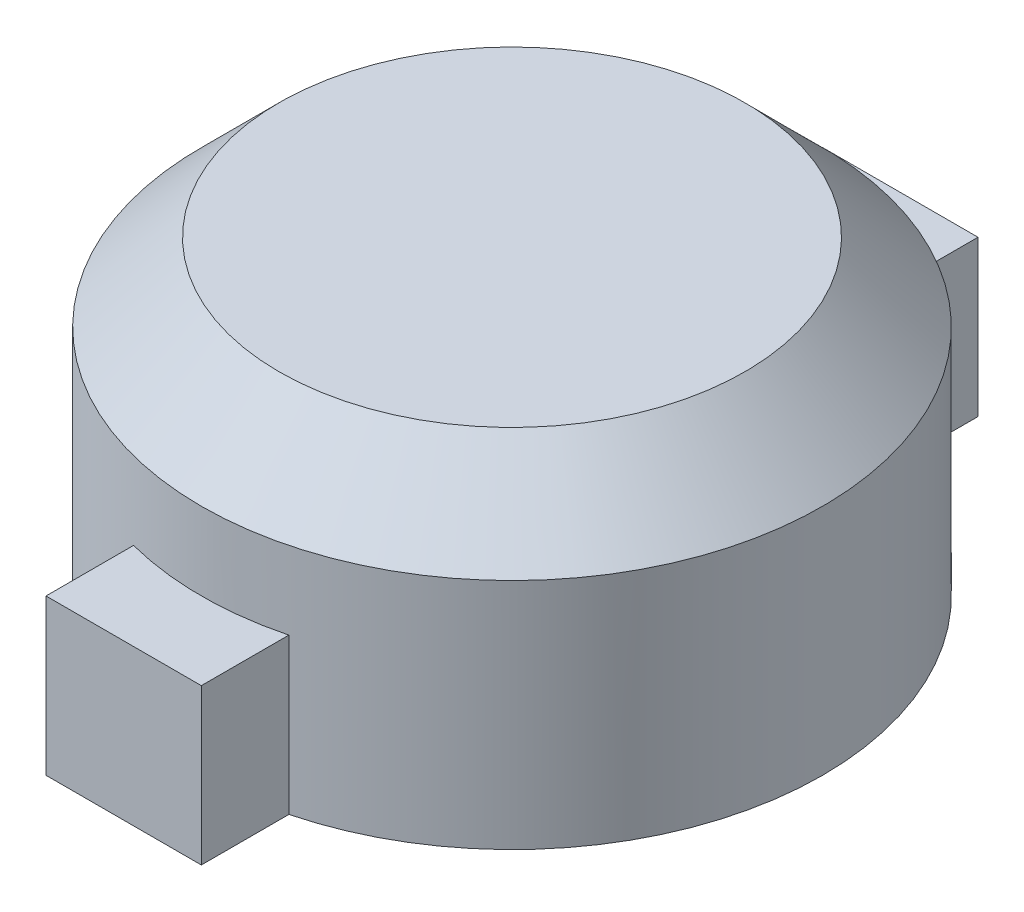
ISO-10303-21;
HEADER;
FILE_DESCRIPTION(('STEP AP214'),'2;1');
FILE_NAME('part.step','',(''),(''),'','','');
FILE_SCHEMA(('AUTOMOTIVE_DESIGN { 1 0 10303 214 1 1 1 1 }'));
ENDSEC;
DATA;
#1=APPLICATION_CONTEXT('core data for automotive mechanical design processes');
#2=APPLICATION_PROTOCOL_DEFINITION('international standard','automotive_design',2000,#1);
#3=PRODUCT_CONTEXT('',#1,'mechanical');
#4=PRODUCT('Part','Part','',(#3));
#5=PRODUCT_RELATED_PRODUCT_CATEGORY('part','',(#4));
#6=PRODUCT_DEFINITION_FORMATION('','',#4);
#7=PRODUCT_DEFINITION_CONTEXT('part definition',#1,'design');
#8=PRODUCT_DEFINITION('design','',#6,#7);
#9=PRODUCT_DEFINITION_SHAPE('','',#8);
#10=(LENGTH_UNIT() NAMED_UNIT(*) SI_UNIT(.MILLI.,.METRE.));
#11=(NAMED_UNIT(*) PLANE_ANGLE_UNIT() SI_UNIT($,.RADIAN.));
#12=(NAMED_UNIT(*) SI_UNIT($,.STERADIAN.) SOLID_ANGLE_UNIT());
#13=UNCERTAINTY_MEASURE_WITH_UNIT(LENGTH_MEASURE(1.E-05),#10,'distance_accuracy_value','');
#14=(GEOMETRIC_REPRESENTATION_CONTEXT(3) GLOBAL_UNCERTAINTY_ASSIGNED_CONTEXT((#13)) GLOBAL_UNIT_ASSIGNED_CONTEXT((#10,
#11,#12)) REPRESENTATION_CONTEXT('',''));
#15=CARTESIAN_POINT('',(0.,0.,0.));
#16=DIRECTION('',(0.,0.,1.));
#17=DIRECTION('',(1.,0.,0.));
#18=AXIS2_PLACEMENT_3D('',#15,#16,#17);
#19=CARTESIAN_POINT('',(0.,4.,0.));
#20=DIRECTION('',(0.,-1.,0.));
#21=DIRECTION('',(0.,0.,-1.));
#22=AXIS2_PLACEMENT_3D('',#19,#20,#21);
#23=CYLINDRICAL_SURFACE('',#22,4.);
#24=CARTESIAN_POINT('',(0.,2.99999999999999,0.));
#25=DIRECTION('',(0.,1.,0.));
#26=DIRECTION('',(0.,0.,1.));
#27=AXIS2_PLACEMENT_3D('',#24,#25,#26);
#28=CIRCLE('',#27,4.);
#29=CARTESIAN_POINT('',(0.,2.99999999999999,4.));
#30=VERTEX_POINT('',#29);
#31=EDGE_CURVE('E11',#30,#30,#28,.F.);
#32=ORIENTED_EDGE('',*,*,#31,.T.);
#33=EDGE_LOOP('',(#32));
#34=FACE_BOUND('',#33,.T.);
#35=CARTESIAN_POINT('',(0.,2.,0.));
#36=DIRECTION('',(0.,1.,0.));
#37=DIRECTION('',(0.,0.,1.));
#38=AXIS2_PLACEMENT_3D('',#35,#36,#37);
#39=CIRCLE('',#38,4.);
#40=CARTESIAN_POINT('',(1.,2.,-3.87298334620742));
#41=VERTEX_POINT('',#40);
#42=CARTESIAN_POINT('',(-0.999999999999999,2.,-3.87298334620742));
#43=VERTEX_POINT('',#42);
#44=EDGE_CURVE('E48',#41,#43,#39,.T.);
#45=ORIENTED_EDGE('',*,*,#44,.T.);
#46=DIRECTION('',(0.,-1.,0.));
#47=VECTOR('',#46,1.);
#48=CARTESIAN_POINT('',(-0.999999999999999,4.,-3.87298334620742));
#49=LINE('',#48,#47);
#50=CARTESIAN_POINT('',(-0.999999999999999,0.,-3.87298334620742));
#51=VERTEX_POINT('',#50);
#52=EDGE_CURVE('E103',#43,#51,#49,.T.);
#53=ORIENTED_EDGE('',*,*,#52,.T.);
#54=CARTESIAN_POINT('',(0.,0.,0.));
#55=DIRECTION('',(0.,1.,0.));
#56=DIRECTION('',(0.,0.,1.));
#57=AXIS2_PLACEMENT_3D('',#54,#55,#56);
#58=CIRCLE('',#57,4.);
#59=CARTESIAN_POINT('',(-1.,0.,3.87298334620742));
#60=VERTEX_POINT('',#59);
#61=EDGE_CURVE('E153',#51,#60,#58,.T.);
#62=ORIENTED_EDGE('',*,*,#61,.T.);
#63=DIRECTION('',(0.,-1.,0.));
#64=VECTOR('',#63,1.);
#65=CARTESIAN_POINT('',(-1.,4.,3.87298334620742));
#66=LINE('',#65,#64);
#67=CARTESIAN_POINT('',(-1.,2.,3.87298334620742));
#68=VERTEX_POINT('',#67);
#69=EDGE_CURVE('E150',#60,#68,#66,.F.);
#70=ORIENTED_EDGE('',*,*,#69,.T.);
#71=CARTESIAN_POINT('',(1.,2.,3.87298334620742));
#72=VERTEX_POINT('',#71);
#73=EDGE_CURVE('E156',#68,#72,#39,.T.);
#74=ORIENTED_EDGE('',*,*,#73,.T.);
#75=DIRECTION('',(0.,-1.,0.));
#76=VECTOR('',#75,1.);
#77=CARTESIAN_POINT('',(1.,4.,3.87298334620742));
#78=LINE('',#77,#76);
#79=CARTESIAN_POINT('',(1.,0.,3.87298334620742));
#80=VERTEX_POINT('',#79);
#81=EDGE_CURVE('E147',#72,#80,#78,.T.);
#82=ORIENTED_EDGE('',*,*,#81,.T.);
#83=CARTESIAN_POINT('',(1.,0.,-3.87298334620742));
#84=VERTEX_POINT('',#83);
#85=EDGE_CURVE('E154',#80,#84,#58,.T.);
#86=ORIENTED_EDGE('',*,*,#85,.T.);
#87=DIRECTION('',(0.,-1.,0.));
#88=VECTOR('',#87,1.);
#89=CARTESIAN_POINT('',(1.,4.,-3.87298334620742));
#90=LINE('',#89,#88);
#91=EDGE_CURVE('E53',#84,#41,#90,.F.);
#92=ORIENTED_EDGE('',*,*,#91,.T.);
#93=EDGE_LOOP('',(#45,#53,#62,#70,#74,#82,#86,#92));
#94=FACE_BOUND('',#93,.T.);
#95=ADVANCED_FACE('F33',(#34,#94),#23,.T.);
#96=CARTESIAN_POINT('',(0.,4.,0.));
#97=DIRECTION('',(0.,1.,0.));
#98=DIRECTION('',(0.,0.,1.));
#99=AXIS2_PLACEMENT_3D('',#96,#97,#98);
#100=PLANE('',#99);
#101=CARTESIAN_POINT('',(0.,4.,0.));
#102=DIRECTION('',(0.,1.,0.));
#103=DIRECTION('',(0.,0.,1.));
#104=AXIS2_PLACEMENT_3D('',#101,#102,#103);
#105=CIRCLE('',#104,3.);
#106=CARTESIAN_POINT('',(0.,4.,3.));
#107=VERTEX_POINT('',#106);
#108=EDGE_CURVE('E41',#107,#107,#105,.T.);
#109=ORIENTED_EDGE('',*,*,#108,.T.);
#110=EDGE_LOOP('',(#109));
#111=FACE_BOUND('',#110,.T.);
#112=ADVANCED_FACE('F160',(#111),#100,.T.);
#113=CARTESIAN_POINT('',(0.,0.,0.));
#114=DIRECTION('',(0.,1.,0.));
#115=DIRECTION('',(0.,0.,1.));
#116=AXIS2_PLACEMENT_3D('',#113,#114,#115);
#117=PLANE('',#116);
#118=ORIENTED_EDGE('',*,*,#85,.F.);
#119=DIRECTION('',(0.,0.,1.));
#120=VECTOR('',#119,1.);
#121=CARTESIAN_POINT('',(1.,0.,5.));
#122=LINE('',#121,#120);
#123=CARTESIAN_POINT('',(1.,0.,5.));
#124=VERTEX_POINT('',#123);
#125=EDGE_CURVE('E134',#80,#124,#122,.T.);
#126=ORIENTED_EDGE('',*,*,#125,.T.);
#127=DIRECTION('',(-1.,0.,0.));
#128=VECTOR('',#127,1.);
#129=CARTESIAN_POINT('',(1.,0.,5.));
#130=LINE('',#129,#128);
#131=CARTESIAN_POINT('',(-1.,0.,5.));
#132=VERTEX_POINT('',#131);
#133=EDGE_CURVE('E107',#124,#132,#130,.T.);
#134=ORIENTED_EDGE('',*,*,#133,.T.);
#135=DIRECTION('',(0.,0.,-1.));
#136=VECTOR('',#135,1.);
#137=CARTESIAN_POINT('',(-1.,0.,5.));
#138=LINE('',#137,#136);
#139=EDGE_CURVE('E129',#132,#60,#138,.T.);
#140=ORIENTED_EDGE('',*,*,#139,.T.);
#141=ORIENTED_EDGE('',*,*,#61,.F.);
#142=CARTESIAN_POINT('',(-0.999999999999999,0.,-5.));
#143=VERTEX_POINT('',#142);
#144=EDGE_CURVE('E132',#51,#143,#138,.T.);
#145=ORIENTED_EDGE('',*,*,#144,.T.);
#146=DIRECTION('',(1.,0.,0.));
#147=VECTOR('',#146,1.);
#148=CARTESIAN_POINT('',(1.,0.,-5.));
#149=LINE('',#148,#147);
#150=CARTESIAN_POINT('',(1.,0.,-5.));
#151=VERTEX_POINT('',#150);
#152=EDGE_CURVE('E114',#143,#151,#149,.T.);
#153=ORIENTED_EDGE('',*,*,#152,.T.);
#154=EDGE_CURVE('E135',#151,#84,#122,.T.);
#155=ORIENTED_EDGE('',*,*,#154,.T.);
#156=EDGE_LOOP('',(#118,#126,#134,#140,#141,#145,#153,#155));
#157=FACE_BOUND('',#156,.T.);
#158=ADVANCED_FACE('F176',(#157),#117,.F.);
#159=CARTESIAN_POINT('',(1.,2.,5.));
#160=DIRECTION('',(0.,0.,1.));
#161=DIRECTION('',(1.,0.,0.));
#162=AXIS2_PLACEMENT_3D('',#159,#160,#161);
#163=PLANE('',#162);
#164=ORIENTED_EDGE('',*,*,#133,.F.);
#165=DIRECTION('',(0.,-1.,0.));
#166=VECTOR('',#165,1.);
#167=CARTESIAN_POINT('',(1.,2.,5.));
#168=LINE('',#167,#166);
#169=CARTESIAN_POINT('',(1.,2.,5.));
#170=VERTEX_POINT('',#169);
#171=EDGE_CURVE('E142',#170,#124,#168,.T.);
#172=ORIENTED_EDGE('',*,*,#171,.F.);
#173=DIRECTION('',(-1.,0.,0.));
#174=VECTOR('',#173,1.);
#175=CARTESIAN_POINT('',(1.,2.,5.));
#176=LINE('',#175,#174);
#177=CARTESIAN_POINT('',(-1.,2.,5.));
#178=VERTEX_POINT('',#177);
#179=EDGE_CURVE('E116',#170,#178,#176,.T.);
#180=ORIENTED_EDGE('',*,*,#179,.T.);
#181=DIRECTION('',(0.,-1.,0.));
#182=VECTOR('',#181,1.);
#183=CARTESIAN_POINT('',(-1.,2.,5.));
#184=LINE('',#183,#182);
#185=EDGE_CURVE('E140',#178,#132,#184,.T.);
#186=ORIENTED_EDGE('',*,*,#185,.T.);
#187=EDGE_LOOP('',(#164,#172,#180,#186));
#188=FACE_BOUND('',#187,.T.);
#189=ADVANCED_FACE('F180',(#188),#163,.T.);
#190=CARTESIAN_POINT('',(0.,2.,0.));
#191=DIRECTION('',(0.,1.,0.));
#192=DIRECTION('',(0.,0.,1.));
#193=AXIS2_PLACEMENT_3D('',#190,#191,#192);
#194=PLANE('',#193);
#195=ORIENTED_EDGE('',*,*,#73,.F.);
#196=DIRECTION('',(0.,0.,-1.));
#197=VECTOR('',#196,1.);
#198=CARTESIAN_POINT('',(-1.,2.,5.));
#199=LINE('',#198,#197);
#200=EDGE_CURVE('E106',#178,#68,#199,.T.);
#201=ORIENTED_EDGE('',*,*,#200,.F.);
#202=ORIENTED_EDGE('',*,*,#179,.F.);
#203=DIRECTION('',(0.,0.,1.));
#204=VECTOR('',#203,1.);
#205=CARTESIAN_POINT('',(1.,2.,5.));
#206=LINE('',#205,#204);
#207=EDGE_CURVE('E122',#72,#170,#206,.T.);
#208=ORIENTED_EDGE('',*,*,#207,.F.);
#209=EDGE_LOOP('',(#195,#201,#202,#208));
#210=FACE_BOUND('',#209,.T.);
#211=ADVANCED_FACE('F189',(#210),#194,.T.);
#212=CARTESIAN_POINT('',(1.,2.,5.));
#213=DIRECTION('',(1.,0.,0.));
#214=DIRECTION('',(0.,0.,-1.));
#215=AXIS2_PLACEMENT_3D('',#212,#213,#214);
#216=PLANE('',#215);
#217=ORIENTED_EDGE('',*,*,#81,.F.);
#218=ORIENTED_EDGE('',*,*,#207,.T.);
#219=ORIENTED_EDGE('',*,*,#171,.T.);
#220=ORIENTED_EDGE('',*,*,#125,.F.);
#221=EDGE_LOOP('',(#217,#218,#219,#220));
#222=FACE_BOUND('',#221,.T.);
#223=ADVANCED_FACE('F186',(#222),#216,.T.);
#224=CARTESIAN_POINT('',(-1.,2.,5.));
#225=DIRECTION('',(-1.,0.,0.));
#226=DIRECTION('',(0.,0.,1.));
#227=AXIS2_PLACEMENT_3D('',#224,#225,#226);
#228=PLANE('',#227);
#229=ORIENTED_EDGE('',*,*,#69,.F.);
#230=ORIENTED_EDGE('',*,*,#139,.F.);
#231=ORIENTED_EDGE('',*,*,#185,.F.);
#232=ORIENTED_EDGE('',*,*,#200,.T.);
#233=EDGE_LOOP('',(#229,#230,#231,#232));
#234=FACE_BOUND('',#233,.T.);
#235=ADVANCED_FACE('F184',(#234),#228,.T.);
#236=ORIENTED_EDGE('',*,*,#44,.F.);
#237=CARTESIAN_POINT('',(1.,2.,-5.));
#238=VERTEX_POINT('',#237);
#239=EDGE_CURVE('E121',#238,#41,#206,.T.);
#240=ORIENTED_EDGE('',*,*,#239,.F.);
#241=DIRECTION('',(1.,0.,0.));
#242=VECTOR('',#241,1.);
#243=CARTESIAN_POINT('',(1.,2.,-5.));
#244=LINE('',#243,#242);
#245=CARTESIAN_POINT('',(-0.999999999999999,2.,-5.));
#246=VERTEX_POINT('',#245);
#247=EDGE_CURVE('E112',#246,#238,#244,.T.);
#248=ORIENTED_EDGE('',*,*,#247,.F.);
#249=EDGE_CURVE('E97',#43,#246,#199,.T.);
#250=ORIENTED_EDGE('',*,*,#249,.F.);
#251=EDGE_LOOP('',(#236,#240,#248,#250));
#252=FACE_BOUND('',#251,.T.);
#253=ADVANCED_FACE('F119',(#252),#194,.T.);
#254=ORIENTED_EDGE('',*,*,#52,.F.);
#255=ORIENTED_EDGE('',*,*,#249,.T.);
#256=DIRECTION('',(0.,-1.,0.));
#257=VECTOR('',#256,1.);
#258=CARTESIAN_POINT('',(-0.999999999999999,2.,-5.));
#259=LINE('',#258,#257);
#260=EDGE_CURVE('E101',#246,#143,#259,.T.);
#261=ORIENTED_EDGE('',*,*,#260,.T.);
#262=ORIENTED_EDGE('',*,*,#144,.F.);
#263=EDGE_LOOP('',(#254,#255,#261,#262));
#264=FACE_BOUND('',#263,.T.);
#265=ADVANCED_FACE('F99',(#264),#228,.T.);
#266=ORIENTED_EDGE('',*,*,#91,.F.);
#267=ORIENTED_EDGE('',*,*,#154,.F.);
#268=DIRECTION('',(0.,-1.,0.));
#269=VECTOR('',#268,1.);
#270=CARTESIAN_POINT('',(1.,2.,-5.));
#271=LINE('',#270,#269);
#272=EDGE_CURVE('E115',#238,#151,#271,.T.);
#273=ORIENTED_EDGE('',*,*,#272,.F.);
#274=ORIENTED_EDGE('',*,*,#239,.T.);
#275=EDGE_LOOP('',(#266,#267,#273,#274));
#276=FACE_BOUND('',#275,.T.);
#277=ADVANCED_FACE('F167',(#276),#216,.T.);
#278=CARTESIAN_POINT('',(1.,2.,-5.));
#279=DIRECTION('',(0.,0.,-1.));
#280=DIRECTION('',(-1.,0.,0.));
#281=AXIS2_PLACEMENT_3D('',#278,#279,#280);
#282=PLANE('',#281);
#283=ORIENTED_EDGE('',*,*,#152,.F.);
#284=ORIENTED_EDGE('',*,*,#260,.F.);
#285=ORIENTED_EDGE('',*,*,#247,.T.);
#286=ORIENTED_EDGE('',*,*,#272,.T.);
#287=EDGE_LOOP('',(#283,#284,#285,#286));
#288=FACE_BOUND('',#287,.T.);
#289=ADVANCED_FACE('F111',(#288),#282,.T.);
#290=CARTESIAN_POINT('',(0.,4.,0.));
#291=DIRECTION('',(0.,-1.,0.));
#292=DIRECTION('',(0.,0.,-1.));
#293=AXIS2_PLACEMENT_3D('',#290,#291,#292);
#294=CONICAL_SURFACE('',#293,3.,0.785398163397447);
#295=ORIENTED_EDGE('',*,*,#31,.F.);
#296=EDGE_LOOP('',(#295));
#297=FACE_BOUND('',#296,.T.);
#298=ORIENTED_EDGE('',*,*,#108,.F.);
#299=EDGE_LOOP('',(#298));
#300=FACE_BOUND('',#299,.T.);
#301=ADVANCED_FACE('F35',(#297,#300),#294,.T.);
#302=CLOSED_SHELL('',(#95,#112,#158,#189,#211,#223,#235,#253,#265,#277,#289,#301));
#303=MANIFOLD_SOLID_BREP('B2',#302);
#304=ADVANCED_BREP_SHAPE_REPRESENTATION('',(#18,#303),#14);
#305=SHAPE_DEFINITION_REPRESENTATION(#9,#304);
ENDSEC;
END-ISO-10303-21;
